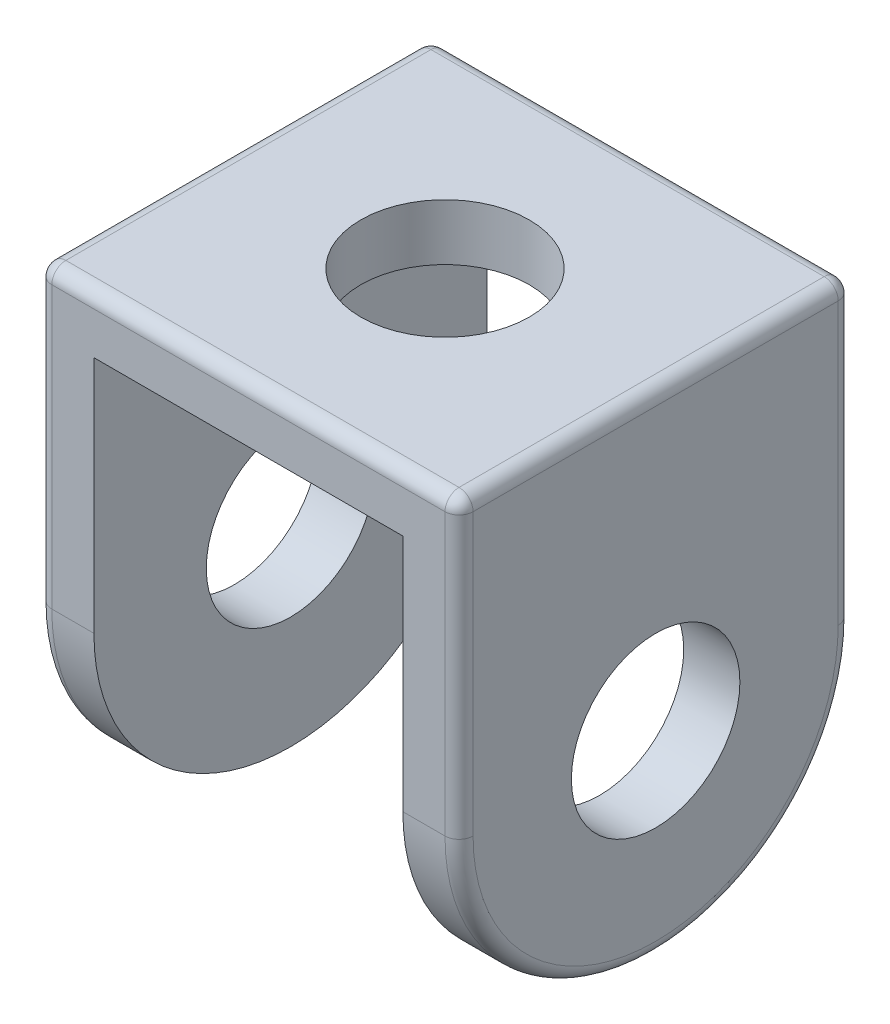
ISO-10303-21;
HEADER;
FILE_DESCRIPTION(('STEP AP214'),'2;1');
FILE_NAME('part.step','',(''),(''),'','','');
FILE_SCHEMA(('AUTOMOTIVE_DESIGN { 1 0 10303 214 1 1 1 1 }'));
ENDSEC;
DATA;
#1=APPLICATION_CONTEXT('core data for automotive mechanical design processes');
#2=APPLICATION_PROTOCOL_DEFINITION('international standard','automotive_design',2000,#1);
#3=PRODUCT_CONTEXT('',#1,'mechanical');
#4=PRODUCT('Part','Part','',(#3));
#5=PRODUCT_RELATED_PRODUCT_CATEGORY('part','',(#4));
#6=PRODUCT_DEFINITION_FORMATION('','',#4);
#7=PRODUCT_DEFINITION_CONTEXT('part definition',#1,'design');
#8=PRODUCT_DEFINITION('design','',#6,#7);
#9=PRODUCT_DEFINITION_SHAPE('','',#8);
#10=(LENGTH_UNIT() NAMED_UNIT(*) SI_UNIT(.MILLI.,.METRE.));
#11=(NAMED_UNIT(*) PLANE_ANGLE_UNIT() SI_UNIT($,.RADIAN.));
#12=(NAMED_UNIT(*) SI_UNIT($,.STERADIAN.) SOLID_ANGLE_UNIT());
#13=UNCERTAINTY_MEASURE_WITH_UNIT(LENGTH_MEASURE(1.E-05),#10,'distance_accuracy_value','');
#14=(GEOMETRIC_REPRESENTATION_CONTEXT(3) GLOBAL_UNCERTAINTY_ASSIGNED_CONTEXT((#13)) GLOBAL_UNIT_ASSIGNED_CONTEXT((#10,
#11,#12)) REPRESENTATION_CONTEXT('',''));
#15=CARTESIAN_POINT('',(0.,0.,0.));
#16=DIRECTION('',(0.,0.,1.));
#17=DIRECTION('',(1.,0.,0.));
#18=AXIS2_PLACEMENT_3D('',#15,#16,#17);
#19=CARTESIAN_POINT('',(30.,-21.,-14.));
#20=DIRECTION('',(-1.,0.,0.));
#21=DIRECTION('',(0.,0.,1.));
#22=AXIS2_PLACEMENT_3D('',#19,#20,#21);
#23=CYLINDRICAL_SURFACE('',#22,14.);
#24=DIRECTION('',(-1.,0.,0.));
#25=VECTOR('',#24,1.);
#26=CARTESIAN_POINT('',(30.,-21.,0.));
#27=LINE('',#26,#25);
#28=CARTESIAN_POINT('',(4.,-21.,0.));
#29=VERTEX_POINT('',#28);
#30=CARTESIAN_POINT('',(1.,-21.,0.));
#31=VERTEX_POINT('',#30);
#32=EDGE_CURVE('E188',#29,#31,#27,.T.);
#33=ORIENTED_EDGE('',*,*,#32,.T.);
#34=CARTESIAN_POINT('',(1.,-21.,-14.));
#35=DIRECTION('',(1.,0.,0.));
#36=DIRECTION('',(0.,0.,-1.));
#37=AXIS2_PLACEMENT_3D('',#34,#35,#36);
#38=CIRCLE('',#37,14.);
#39=CARTESIAN_POINT('',(1.,-21.,-28.));
#40=VERTEX_POINT('',#39);
#41=EDGE_CURVE('E214',#31,#40,#38,.T.);
#42=ORIENTED_EDGE('',*,*,#41,.T.);
#43=DIRECTION('',(-1.,0.,0.));
#44=VECTOR('',#43,1.);
#45=CARTESIAN_POINT('',(30.,-21.,-28.));
#46=LINE('',#45,#44);
#47=CARTESIAN_POINT('',(4.,-21.,-28.));
#48=VERTEX_POINT('',#47);
#49=EDGE_CURVE('E183',#48,#40,#46,.T.);
#50=ORIENTED_EDGE('',*,*,#49,.F.);
#51=CARTESIAN_POINT('',(4.00000000000001,-21.,-14.));
#52=DIRECTION('',(-1.,0.,0.));
#53=DIRECTION('',(0.,-1.,0.));
#54=AXIS2_PLACEMENT_3D('',#51,#52,#53);
#55=CIRCLE('',#54,14.);
#56=EDGE_CURVE('E155',#48,#29,#55,.T.);
#57=ORIENTED_EDGE('',*,*,#56,.T.);
#58=EDGE_LOOP('',(#33,#42,#50,#57));
#59=FACE_BOUND('',#58,.T.);
#60=ADVANCED_FACE('F37',(#59),#23,.T.);
#61=CARTESIAN_POINT('',(30.,-21.,-14.));
#62=DIRECTION('',(-1.,0.,0.));
#63=DIRECTION('',(0.,0.,1.));
#64=AXIS2_PLACEMENT_3D('',#61,#62,#63);
#65=CYLINDRICAL_SURFACE('',#64,6.);
#66=CARTESIAN_POINT('',(4.00000000000001,-21.,-14.));
#67=DIRECTION('',(-1.,0.,0.));
#68=DIRECTION('',(0.,-1.,0.));
#69=AXIS2_PLACEMENT_3D('',#66,#67,#68);
#70=CIRCLE('',#69,6.);
#71=CARTESIAN_POINT('',(4.00000000000001,-27.,-14.));
#72=VERTEX_POINT('',#71);
#73=EDGE_CURVE('E177',#72,#72,#70,.T.);
#74=ORIENTED_EDGE('',*,*,#73,.F.);
#75=EDGE_LOOP('',(#74));
#76=FACE_BOUND('',#75,.T.);
#77=CARTESIAN_POINT('',(0.,-21.,-14.));
#78=DIRECTION('',(1.,0.,0.));
#79=DIRECTION('',(0.,0.,-1.));
#80=AXIS2_PLACEMENT_3D('',#77,#78,#79);
#81=CIRCLE('',#80,6.);
#82=CARTESIAN_POINT('',(0.,-21.,-20.));
#83=VERTEX_POINT('',#82);
#84=EDGE_CURVE('E179',#83,#83,#81,.T.);
#85=ORIENTED_EDGE('',*,*,#84,.F.);
#86=EDGE_LOOP('',(#85));
#87=FACE_BOUND('',#86,.T.);
#88=ADVANCED_FACE('F310',(#76,#87),#65,.F.);
#89=CARTESIAN_POINT('',(30.,-21.,-14.));
#90=DIRECTION('',(1.,0.,0.));
#91=DIRECTION('',(0.,0.,-1.));
#92=AXIS2_PLACEMENT_3D('',#89,#90,#91);
#93=PLANE('',#92);
#94=CARTESIAN_POINT('',(30.,-21.,-14.));
#95=DIRECTION('',(1.,0.,0.));
#96=DIRECTION('',(0.,0.,-1.));
#97=AXIS2_PLACEMENT_3D('',#94,#95,#96);
#98=CIRCLE('',#97,13.);
#99=CARTESIAN_POINT('',(30.,-21.,-1.));
#100=VERTEX_POINT('',#99);
#101=CARTESIAN_POINT('',(30.,-21.,-27.));
#102=VERTEX_POINT('',#101);
#103=EDGE_CURVE('E220',#100,#102,#98,.T.);
#104=ORIENTED_EDGE('',*,*,#103,.T.);
#105=DIRECTION('',(0.,1.,0.));
#106=VECTOR('',#105,1.);
#107=CARTESIAN_POINT('',(30.,0.,-27.));
#108=LINE('',#107,#106);
#109=CARTESIAN_POINT('',(30.,-1.,-27.));
#110=VERTEX_POINT('',#109);
#111=EDGE_CURVE('E222',#102,#110,#108,.T.);
#112=ORIENTED_EDGE('',*,*,#111,.T.);
#113=DIRECTION('',(0.,0.,1.));
#114=VECTOR('',#113,1.);
#115=CARTESIAN_POINT('',(30.,-1.,0.));
#116=LINE('',#115,#114);
#117=CARTESIAN_POINT('',(30.,-1.,-1.));
#118=VERTEX_POINT('',#117);
#119=EDGE_CURVE('E216',#110,#118,#116,.T.);
#120=ORIENTED_EDGE('',*,*,#119,.T.);
#121=DIRECTION('',(0.,-1.,0.));
#122=VECTOR('',#121,1.);
#123=CARTESIAN_POINT('',(30.,-21.,-1.));
#124=LINE('',#123,#122);
#125=EDGE_CURVE('E218',#118,#100,#124,.T.);
#126=ORIENTED_EDGE('',*,*,#125,.T.);
#127=EDGE_LOOP('',(#104,#112,#120,#126));
#128=FACE_BOUND('',#127,.T.);
#129=CARTESIAN_POINT('',(30.,-21.,-14.));
#130=DIRECTION('',(1.,0.,0.));
#131=DIRECTION('',(0.,0.,-1.));
#132=AXIS2_PLACEMENT_3D('',#129,#130,#131);
#133=CIRCLE('',#132,6.);
#134=CARTESIAN_POINT('',(30.,-21.,-20.));
#135=VERTEX_POINT('',#134);
#136=EDGE_CURVE('E180',#135,#135,#133,.T.);
#137=ORIENTED_EDGE('',*,*,#136,.F.);
#138=EDGE_LOOP('',(#137));
#139=FACE_BOUND('',#138,.T.);
#140=ADVANCED_FACE('F305',(#128,#139),#93,.T.);
#141=CARTESIAN_POINT('',(0.,-21.,-14.));
#142=DIRECTION('',(1.,0.,0.));
#143=DIRECTION('',(0.,0.,-1.));
#144=AXIS2_PLACEMENT_3D('',#141,#142,#143);
#145=PLANE('',#144);
#146=DIRECTION('',(0.,0.,1.));
#147=VECTOR('',#146,1.);
#148=CARTESIAN_POINT('',(0.,-1.,-14.));
#149=LINE('',#148,#147);
#150=CARTESIAN_POINT('',(0.,-1.,-1.));
#151=VERTEX_POINT('',#150);
#152=CARTESIAN_POINT('',(0.,-1.,-27.));
#153=VERTEX_POINT('',#152);
#154=EDGE_CURVE('E205',#151,#153,#149,.F.);
#155=ORIENTED_EDGE('',*,*,#154,.T.);
#156=DIRECTION('',(0.,1.,0.));
#157=VECTOR('',#156,1.);
#158=CARTESIAN_POINT('',(0.,-21.,-27.));
#159=LINE('',#158,#157);
#160=CARTESIAN_POINT('',(0.,-21.,-27.));
#161=VERTEX_POINT('',#160);
#162=EDGE_CURVE('E211',#153,#161,#159,.F.);
#163=ORIENTED_EDGE('',*,*,#162,.T.);
#164=CARTESIAN_POINT('',(0.,-21.,-14.));
#165=DIRECTION('',(1.,0.,0.));
#166=DIRECTION('',(0.,0.,-1.));
#167=AXIS2_PLACEMENT_3D('',#164,#165,#166);
#168=CIRCLE('',#167,13.);
#169=CARTESIAN_POINT('',(0.,-21.,-1.));
#170=VERTEX_POINT('',#169);
#171=EDGE_CURVE('E209',#161,#170,#168,.F.);
#172=ORIENTED_EDGE('',*,*,#171,.T.);
#173=DIRECTION('',(0.,-1.,0.));
#174=VECTOR('',#173,1.);
#175=CARTESIAN_POINT('',(0.,-21.,-1.));
#176=LINE('',#175,#174);
#177=EDGE_CURVE('E207',#170,#151,#176,.F.);
#178=ORIENTED_EDGE('',*,*,#177,.T.);
#179=EDGE_LOOP('',(#155,#163,#172,#178));
#180=FACE_BOUND('',#179,.T.);
#181=ORIENTED_EDGE('',*,*,#84,.T.);
#182=EDGE_LOOP('',(#181));
#183=FACE_BOUND('',#182,.T.);
#184=ADVANCED_FACE('F296',(#180,#183),#145,.F.);
#185=CARTESIAN_POINT('',(30.,0.,-28.));
#186=DIRECTION('',(0.,-1.,0.));
#187=DIRECTION('',(0.,0.,-1.));
#188=AXIS2_PLACEMENT_3D('',#185,#186,#187);
#189=PLANE('',#188);
#190=DIRECTION('',(-1.,0.,0.));
#191=VECTOR('',#190,1.);
#192=CARTESIAN_POINT('',(30.,0.,-1.));
#193=LINE('',#192,#191);
#194=CARTESIAN_POINT('',(1.,0.,-1.));
#195=VERTEX_POINT('',#194);
#196=CARTESIAN_POINT('',(29.,0.,-1.));
#197=VERTEX_POINT('',#196);
#198=EDGE_CURVE('E233',#195,#197,#193,.F.);
#199=ORIENTED_EDGE('',*,*,#198,.T.);
#200=DIRECTION('',(0.,0.,1.));
#201=VECTOR('',#200,1.);
#202=CARTESIAN_POINT('',(29.,0.,-28.));
#203=LINE('',#202,#201);
#204=CARTESIAN_POINT('',(29.,0.,-27.));
#205=VERTEX_POINT('',#204);
#206=EDGE_CURVE('E11',#197,#205,#203,.F.);
#207=ORIENTED_EDGE('',*,*,#206,.T.);
#208=DIRECTION('',(-1.,0.,0.));
#209=VECTOR('',#208,1.);
#210=CARTESIAN_POINT('',(30.,0.,-27.));
#211=LINE('',#210,#209);
#212=CARTESIAN_POINT('',(1.,0.,-27.));
#213=VERTEX_POINT('',#212);
#214=EDGE_CURVE('E46',#205,#213,#211,.T.);
#215=ORIENTED_EDGE('',*,*,#214,.T.);
#216=DIRECTION('',(0.,0.,1.));
#217=VECTOR('',#216,1.);
#218=CARTESIAN_POINT('',(1.,0.,-28.));
#219=LINE('',#218,#217);
#220=EDGE_CURVE('E235',#213,#195,#219,.T.);
#221=ORIENTED_EDGE('',*,*,#220,.T.);
#222=EDGE_LOOP('',(#199,#207,#215,#221));
#223=FACE_BOUND('',#222,.T.);
#224=CARTESIAN_POINT('',(15.,0.,-14.));
#225=DIRECTION('',(0.,1.,0.));
#226=DIRECTION('',(0.,0.,1.));
#227=AXIS2_PLACEMENT_3D('',#224,#225,#226);
#228=CIRCLE('',#227,6.);
#229=CARTESIAN_POINT('',(15.,0.,-8.));
#230=VERTEX_POINT('',#229);
#231=EDGE_CURVE('E198',#230,#230,#228,.T.);
#232=ORIENTED_EDGE('',*,*,#231,.F.);
#233=EDGE_LOOP('',(#232));
#234=FACE_BOUND('',#233,.T.);
#235=ADVANCED_FACE('F293',(#223,#234),#189,.F.);
#236=CARTESIAN_POINT('',(30.,0.,0.));
#237=DIRECTION('',(0.,0.,-1.));
#238=DIRECTION('',(0.,1.,0.));
#239=AXIS2_PLACEMENT_3D('',#236,#237,#238);
#240=PLANE('',#239);
#241=DIRECTION('',(-1.,0.,0.));
#242=VECTOR('',#241,1.);
#243=CARTESIAN_POINT('',(30.,-1.,0.));
#244=LINE('',#243,#242);
#245=CARTESIAN_POINT('',(29.,-1.,0.));
#246=VERTEX_POINT('',#245);
#247=CARTESIAN_POINT('',(1.,-1.,0.));
#248=VERTEX_POINT('',#247);
#249=EDGE_CURVE('E227',#246,#248,#244,.T.);
#250=ORIENTED_EDGE('',*,*,#249,.T.);
#251=DIRECTION('',(0.,-1.,0.));
#252=VECTOR('',#251,1.);
#253=CARTESIAN_POINT('',(1.,0.,0.));
#254=LINE('',#253,#252);
#255=EDGE_CURVE('E231',#248,#31,#254,.T.);
#256=ORIENTED_EDGE('',*,*,#255,.T.);
#257=ORIENTED_EDGE('',*,*,#32,.F.);
#258=DIRECTION('',(0.,-1.,0.));
#259=VECTOR('',#258,1.);
#260=CARTESIAN_POINT('',(4.,-4.,0.));
#261=LINE('',#260,#259);
#262=CARTESIAN_POINT('',(4.,-4.,0.));
#263=VERTEX_POINT('',#262);
#264=EDGE_CURVE('E168',#263,#29,#261,.T.);
#265=ORIENTED_EDGE('',*,*,#264,.F.);
#266=DIRECTION('',(-1.,0.,0.));
#267=VECTOR('',#266,1.);
#268=CARTESIAN_POINT('',(4.,-4.,0.));
#269=LINE('',#268,#267);
#270=CARTESIAN_POINT('',(26.,-4.,0.));
#271=VERTEX_POINT('',#270);
#272=EDGE_CURVE('E145',#271,#263,#269,.T.);
#273=ORIENTED_EDGE('',*,*,#272,.F.);
#274=DIRECTION('',(0.,1.,0.));
#275=VECTOR('',#274,1.);
#276=CARTESIAN_POINT('',(26.,-4.,0.));
#277=LINE('',#276,#275);
#278=CARTESIAN_POINT('',(26.,-21.,0.));
#279=VERTEX_POINT('',#278);
#280=EDGE_CURVE('E170',#279,#271,#277,.T.);
#281=ORIENTED_EDGE('',*,*,#280,.F.);
#282=CARTESIAN_POINT('',(29.,-21.,0.));
#283=VERTEX_POINT('',#282);
#284=EDGE_CURVE('E189',#283,#279,#27,.T.);
#285=ORIENTED_EDGE('',*,*,#284,.F.);
#286=DIRECTION('',(0.,-1.,0.));
#287=VECTOR('',#286,1.);
#288=CARTESIAN_POINT('',(29.,0.,0.));
#289=LINE('',#288,#287);
#290=EDGE_CURVE('E229',#283,#246,#289,.F.);
#291=ORIENTED_EDGE('',*,*,#290,.T.);
#292=EDGE_LOOP('',(#250,#256,#257,#265,#273,#281,#285,#291));
#293=FACE_BOUND('',#292,.T.);
#294=ADVANCED_FACE('F295',(#293),#240,.F.);
#295=CARTESIAN_POINT('',(29.,-21.,-28.));
#296=VERTEX_POINT('',#295);
#297=CARTESIAN_POINT('',(26.,-21.,-28.));
#298=VERTEX_POINT('',#297);
#299=EDGE_CURVE('E186',#296,#298,#46,.T.);
#300=ORIENTED_EDGE('',*,*,#299,.F.);
#301=CARTESIAN_POINT('',(29.,-21.,-14.));
#302=DIRECTION('',(1.,0.,0.));
#303=DIRECTION('',(0.,0.,-1.));
#304=AXIS2_PLACEMENT_3D('',#301,#302,#303);
#305=CIRCLE('',#304,14.);
#306=EDGE_CURVE('E225',#296,#283,#305,.F.);
#307=ORIENTED_EDGE('',*,*,#306,.T.);
#308=ORIENTED_EDGE('',*,*,#284,.T.);
#309=CARTESIAN_POINT('',(26.,-21.,-14.));
#310=DIRECTION('',(1.,0.,0.));
#311=DIRECTION('',(0.,0.,-1.));
#312=AXIS2_PLACEMENT_3D('',#309,#310,#311);
#313=CIRCLE('',#312,14.);
#314=EDGE_CURVE('E174',#279,#298,#313,.T.);
#315=ORIENTED_EDGE('',*,*,#314,.T.);
#316=EDGE_LOOP('',(#300,#307,#308,#315));
#317=FACE_BOUND('',#316,.T.);
#318=ADVANCED_FACE('F302',(#317),#23,.T.);
#319=CARTESIAN_POINT('',(30.,-21.,-28.));
#320=DIRECTION('',(0.,0.,1.));
#321=DIRECTION('',(0.,-1.,0.));
#322=AXIS2_PLACEMENT_3D('',#319,#320,#321);
#323=PLANE('',#322);
#324=ORIENTED_EDGE('',*,*,#49,.T.);
#325=DIRECTION('',(0.,1.,0.));
#326=VECTOR('',#325,1.);
#327=CARTESIAN_POINT('',(1.,-21.,-28.));
#328=LINE('',#327,#326);
#329=CARTESIAN_POINT('',(1.,-1.,-28.));
#330=VERTEX_POINT('',#329);
#331=EDGE_CURVE('E202',#40,#330,#328,.T.);
#332=ORIENTED_EDGE('',*,*,#331,.T.);
#333=DIRECTION('',(-1.,0.,0.));
#334=VECTOR('',#333,1.);
#335=CARTESIAN_POINT('',(30.,-1.,-28.));
#336=LINE('',#335,#334);
#337=CARTESIAN_POINT('',(29.,-1.,-28.));
#338=VERTEX_POINT('',#337);
#339=EDGE_CURVE('E191',#330,#338,#336,.F.);
#340=ORIENTED_EDGE('',*,*,#339,.T.);
#341=DIRECTION('',(0.,1.,0.));
#342=VECTOR('',#341,1.);
#343=CARTESIAN_POINT('',(29.,-21.,-28.));
#344=LINE('',#343,#342);
#345=EDGE_CURVE('E200',#338,#296,#344,.F.);
#346=ORIENTED_EDGE('',*,*,#345,.T.);
#347=ORIENTED_EDGE('',*,*,#299,.T.);
#348=DIRECTION('',(0.,1.,0.));
#349=VECTOR('',#348,1.);
#350=CARTESIAN_POINT('',(26.,-4.,-28.));
#351=LINE('',#350,#349);
#352=CARTESIAN_POINT('',(26.,-4.,-28.));
#353=VERTEX_POINT('',#352);
#354=EDGE_CURVE('E159',#298,#353,#351,.T.);
#355=ORIENTED_EDGE('',*,*,#354,.T.);
#356=DIRECTION('',(-1.,0.,0.));
#357=VECTOR('',#356,1.);
#358=CARTESIAN_POINT('',(4.,-4.,-28.));
#359=LINE('',#358,#357);
#360=CARTESIAN_POINT('',(4.,-4.,-28.));
#361=VERTEX_POINT('',#360);
#362=EDGE_CURVE('E142',#353,#361,#359,.T.);
#363=ORIENTED_EDGE('',*,*,#362,.T.);
#364=DIRECTION('',(0.,-1.,0.));
#365=VECTOR('',#364,1.);
#366=CARTESIAN_POINT('',(4.,-4.,-28.));
#367=LINE('',#366,#365);
#368=EDGE_CURVE('E153',#361,#48,#367,.T.);
#369=ORIENTED_EDGE('',*,*,#368,.T.);
#370=EDGE_LOOP('',(#324,#332,#340,#346,#347,#355,#363,#369));
#371=FACE_BOUND('',#370,.T.);
#372=ADVANCED_FACE('F162',(#371),#323,.F.);
#373=CARTESIAN_POINT('',(26.,-21.,-14.));
#374=DIRECTION('',(1.,0.,0.));
#375=DIRECTION('',(0.,0.,-1.));
#376=AXIS2_PLACEMENT_3D('',#373,#374,#375);
#377=CIRCLE('',#376,6.);
#378=CARTESIAN_POINT('',(26.,-21.,-20.));
#379=VERTEX_POINT('',#378);
#380=EDGE_CURVE('E149',#379,#379,#377,.T.);
#381=ORIENTED_EDGE('',*,*,#380,.F.);
#382=EDGE_LOOP('',(#381));
#383=FACE_BOUND('',#382,.T.);
#384=ORIENTED_EDGE('',*,*,#136,.T.);
#385=EDGE_LOOP('',(#384));
#386=FACE_BOUND('',#385,.T.);
#387=ADVANCED_FACE('F318',(#383,#386),#65,.F.);
#388=CARTESIAN_POINT('',(4.,-4.,-28.));
#389=DIRECTION('',(-1.,0.,0.));
#390=DIRECTION('',(0.,-1.,0.));
#391=AXIS2_PLACEMENT_3D('',#388,#389,#390);
#392=PLANE('',#391);
#393=ORIENTED_EDGE('',*,*,#73,.T.);
#394=EDGE_LOOP('',(#393));
#395=FACE_BOUND('',#394,.T.);
#396=ORIENTED_EDGE('',*,*,#56,.F.);
#397=ORIENTED_EDGE('',*,*,#368,.F.);
#398=DIRECTION('',(0.,0.,1.));
#399=VECTOR('',#398,1.);
#400=CARTESIAN_POINT('',(4.,-4.,-28.));
#401=LINE('',#400,#399);
#402=EDGE_CURVE('E137',#361,#263,#401,.T.);
#403=ORIENTED_EDGE('',*,*,#402,.T.);
#404=ORIENTED_EDGE('',*,*,#264,.T.);
#405=EDGE_LOOP('',(#396,#397,#403,#404));
#406=FACE_BOUND('',#405,.T.);
#407=ADVANCED_FACE('F154',(#395,#406),#392,.F.);
#408=CARTESIAN_POINT('',(26.,-4.,-28.));
#409=DIRECTION('',(1.,0.,0.));
#410=DIRECTION('',(0.,0.,-1.));
#411=AXIS2_PLACEMENT_3D('',#408,#409,#410);
#412=PLANE('',#411);
#413=ORIENTED_EDGE('',*,*,#380,.T.);
#414=EDGE_LOOP('',(#413));
#415=FACE_BOUND('',#414,.T.);
#416=ORIENTED_EDGE('',*,*,#280,.T.);
#417=DIRECTION('',(0.,0.,1.));
#418=VECTOR('',#417,1.);
#419=CARTESIAN_POINT('',(26.,-4.,-28.));
#420=LINE('',#419,#418);
#421=EDGE_CURVE('E150',#353,#271,#420,.T.);
#422=ORIENTED_EDGE('',*,*,#421,.F.);
#423=ORIENTED_EDGE('',*,*,#354,.F.);
#424=ORIENTED_EDGE('',*,*,#314,.F.);
#425=EDGE_LOOP('',(#416,#422,#423,#424));
#426=FACE_BOUND('',#425,.T.);
#427=ADVANCED_FACE('F346',(#415,#426),#412,.F.);
#428=CARTESIAN_POINT('',(4.,-4.,-28.));
#429=DIRECTION('',(0.,1.,0.));
#430=DIRECTION('',(0.,0.,1.));
#431=AXIS2_PLACEMENT_3D('',#428,#429,#430);
#432=PLANE('',#431);
#433=CARTESIAN_POINT('',(15.,-4.,-14.));
#434=DIRECTION('',(0.,1.,0.));
#435=DIRECTION('',(0.,0.,1.));
#436=AXIS2_PLACEMENT_3D('',#433,#434,#435);
#437=CIRCLE('',#436,6.);
#438=CARTESIAN_POINT('',(15.,-4.,-8.));
#439=VERTEX_POINT('',#438);
#440=EDGE_CURVE('E171',#439,#439,#437,.T.);
#441=ORIENTED_EDGE('',*,*,#440,.T.);
#442=EDGE_LOOP('',(#441));
#443=FACE_BOUND('',#442,.T.);
#444=ORIENTED_EDGE('',*,*,#272,.T.);
#445=ORIENTED_EDGE('',*,*,#402,.F.);
#446=ORIENTED_EDGE('',*,*,#362,.F.);
#447=ORIENTED_EDGE('',*,*,#421,.T.);
#448=EDGE_LOOP('',(#444,#445,#446,#447));
#449=FACE_BOUND('',#448,.T.);
#450=ADVANCED_FACE('F139',(#443,#449),#432,.F.);
#451=CARTESIAN_POINT('',(15.,-30.,-14.));
#452=DIRECTION('',(0.,1.,0.));
#453=DIRECTION('',(0.,0.,1.));
#454=AXIS2_PLACEMENT_3D('',#451,#452,#453);
#455=CYLINDRICAL_SURFACE('',#454,6.);
#456=ORIENTED_EDGE('',*,*,#231,.T.);
#457=EDGE_LOOP('',(#456));
#458=FACE_BOUND('',#457,.T.);
#459=ORIENTED_EDGE('',*,*,#440,.F.);
#460=EDGE_LOOP('',(#459));
#461=FACE_BOUND('',#460,.T.);
#462=ADVANCED_FACE('F290',(#458,#461),#455,.F.);
#463=CARTESIAN_POINT('',(29.,-21.,-1.));
#464=DIRECTION('',(0.,1.,0.));
#465=DIRECTION('',(0.,0.,1.));
#466=AXIS2_PLACEMENT_3D('',#463,#464,#465);
#467=CYLINDRICAL_SURFACE('',#466,1.);
#468=CARTESIAN_POINT('',(29.,-1.,-1.));
#469=DIRECTION('',(0.,1.,0.));
#470=DIRECTION('',(0.,0.,1.));
#471=AXIS2_PLACEMENT_3D('',#468,#469,#470);
#472=CIRCLE('',#471,1.);
#473=EDGE_CURVE('E275',#246,#118,#472,.T.);
#474=ORIENTED_EDGE('',*,*,#473,.F.);
#475=ORIENTED_EDGE('',*,*,#290,.F.);
#476=CARTESIAN_POINT('',(29.,-21.,-1.));
#477=DIRECTION('',(0.,-1.,0.));
#478=DIRECTION('',(0.,0.,-1.));
#479=AXIS2_PLACEMENT_3D('',#476,#477,#478);
#480=CIRCLE('',#479,1.);
#481=EDGE_CURVE('E41',#100,#283,#480,.T.);
#482=ORIENTED_EDGE('',*,*,#481,.F.);
#483=ORIENTED_EDGE('',*,*,#125,.F.);
#484=EDGE_LOOP('',(#474,#475,#482,#483));
#485=FACE_BOUND('',#484,.T.);
#486=ADVANCED_FACE('F39',(#485),#467,.T.);
#487=CARTESIAN_POINT('',(29.,-21.,-14.));
#488=DIRECTION('',(1.,0.,0.));
#489=DIRECTION('',(0.,0.,-1.));
#490=AXIS2_PLACEMENT_3D('',#487,#488,#489);
#491=TOROIDAL_SURFACE('',#490,13.,1.);
#492=ORIENTED_EDGE('',*,*,#481,.T.);
#493=ORIENTED_EDGE('',*,*,#306,.F.);
#494=CARTESIAN_POINT('',(29.,-21.,-27.));
#495=DIRECTION('',(0.,1.,0.));
#496=DIRECTION('',(0.,0.,1.));
#497=AXIS2_PLACEMENT_3D('',#494,#495,#496);
#498=CIRCLE('',#497,1.);
#499=EDGE_CURVE('E273',#102,#296,#498,.T.);
#500=ORIENTED_EDGE('',*,*,#499,.F.);
#501=ORIENTED_EDGE('',*,*,#103,.F.);
#502=EDGE_LOOP('',(#492,#493,#500,#501));
#503=FACE_BOUND('',#502,.T.);
#504=ADVANCED_FACE('F330',(#503),#491,.T.);
#505=CARTESIAN_POINT('',(29.,-1.,-1.));
#506=DIRECTION('',(0.,0.,1.));
#507=DIRECTION('',(1.,0.,0.));
#508=AXIS2_PLACEMENT_3D('',#505,#506,#507);
#509=SPHERICAL_SURFACE('',#508,1.);
#510=CARTESIAN_POINT('',(29.,-1.,-1.));
#511=DIRECTION('',(1.,0.,0.));
#512=DIRECTION('',(0.,0.,-1.));
#513=AXIS2_PLACEMENT_3D('',#510,#511,#512);
#514=CIRCLE('',#513,1.);
#515=EDGE_CURVE('E267',#246,#197,#514,.F.);
#516=ORIENTED_EDGE('',*,*,#515,.F.);
#517=ORIENTED_EDGE('',*,*,#473,.T.);
#518=CARTESIAN_POINT('',(29.,-1.,-1.));
#519=DIRECTION('',(0.,0.,1.));
#520=DIRECTION('',(0.,-1.,0.));
#521=AXIS2_PLACEMENT_3D('',#518,#519,#520);
#522=CIRCLE('',#521,1.);
#523=EDGE_CURVE('E270',#197,#118,#522,.F.);
#524=ORIENTED_EDGE('',*,*,#523,.F.);
#525=EDGE_LOOP('',(#516,#517,#524));
#526=FACE_BOUND('',#525,.T.);
#527=ADVANCED_FACE('F374',(#526),#509,.T.);
#528=CARTESIAN_POINT('',(29.,-21.,-27.));
#529=DIRECTION('',(0.,-1.,0.));
#530=DIRECTION('',(0.,0.,-1.));
#531=AXIS2_PLACEMENT_3D('',#528,#529,#530);
#532=CYLINDRICAL_SURFACE('',#531,1.);
#533=ORIENTED_EDGE('',*,*,#499,.T.);
#534=ORIENTED_EDGE('',*,*,#345,.F.);
#535=CARTESIAN_POINT('',(29.,-1.,-27.));
#536=DIRECTION('',(0.,1.,0.));
#537=DIRECTION('',(0.,0.,1.));
#538=AXIS2_PLACEMENT_3D('',#535,#536,#537);
#539=CIRCLE('',#538,1.);
#540=EDGE_CURVE('E264',#110,#338,#539,.T.);
#541=ORIENTED_EDGE('',*,*,#540,.F.);
#542=ORIENTED_EDGE('',*,*,#111,.F.);
#543=EDGE_LOOP('',(#533,#534,#541,#542));
#544=FACE_BOUND('',#543,.T.);
#545=ADVANCED_FACE('F334',(#544),#532,.T.);
#546=CARTESIAN_POINT('',(29.,-1.,-14.));
#547=DIRECTION('',(0.,0.,-1.));
#548=DIRECTION('',(0.,1.,0.));
#549=AXIS2_PLACEMENT_3D('',#546,#547,#548);
#550=CYLINDRICAL_SURFACE('',#549,1.);
#551=ORIENTED_EDGE('',*,*,#523,.T.);
#552=ORIENTED_EDGE('',*,*,#119,.F.);
#553=CARTESIAN_POINT('',(29.,-1.,-27.));
#554=DIRECTION('',(0.,0.,-1.));
#555=DIRECTION('',(-1.,0.,0.));
#556=AXIS2_PLACEMENT_3D('',#553,#554,#555);
#557=CIRCLE('',#556,1.);
#558=EDGE_CURVE('E262',#205,#110,#557,.T.);
#559=ORIENTED_EDGE('',*,*,#558,.F.);
#560=ORIENTED_EDGE('',*,*,#206,.F.);
#561=EDGE_LOOP('',(#551,#552,#559,#560));
#562=FACE_BOUND('',#561,.T.);
#563=ADVANCED_FACE('F370',(#562),#550,.T.);
#564=CARTESIAN_POINT('',(30.,-1.,-1.));
#565=DIRECTION('',(-1.,0.,0.));
#566=DIRECTION('',(0.,0.,1.));
#567=AXIS2_PLACEMENT_3D('',#564,#565,#566);
#568=CYLINDRICAL_SURFACE('',#567,1.);
#569=ORIENTED_EDGE('',*,*,#515,.T.);
#570=ORIENTED_EDGE('',*,*,#198,.F.);
#571=CARTESIAN_POINT('',(1.,-1.,-1.));
#572=DIRECTION('',(-1.,0.,0.));
#573=DIRECTION('',(0.,0.,1.));
#574=AXIS2_PLACEMENT_3D('',#571,#572,#573);
#575=CIRCLE('',#574,1.);
#576=EDGE_CURVE('E259',#248,#195,#575,.T.);
#577=ORIENTED_EDGE('',*,*,#576,.F.);
#578=ORIENTED_EDGE('',*,*,#249,.F.);
#579=EDGE_LOOP('',(#569,#570,#577,#578));
#580=FACE_BOUND('',#579,.T.);
#581=ADVANCED_FACE('F373',(#580),#568,.T.);
#582=CARTESIAN_POINT('',(29.,-1.,-27.));
#583=DIRECTION('',(0.,0.,1.));
#584=DIRECTION('',(1.,0.,0.));
#585=AXIS2_PLACEMENT_3D('',#582,#583,#584);
#586=SPHERICAL_SURFACE('',#585,1.);
#587=ORIENTED_EDGE('',*,*,#558,.T.);
#588=ORIENTED_EDGE('',*,*,#540,.T.);
#589=CARTESIAN_POINT('',(29.,-1.,-27.));
#590=DIRECTION('',(1.,0.,0.));
#591=DIRECTION('',(0.,0.,-1.));
#592=AXIS2_PLACEMENT_3D('',#589,#590,#591);
#593=CIRCLE('',#592,1.);
#594=EDGE_CURVE('E254',#205,#338,#593,.F.);
#595=ORIENTED_EDGE('',*,*,#594,.F.);
#596=EDGE_LOOP('',(#587,#588,#595));
#597=FACE_BOUND('',#596,.T.);
#598=ADVANCED_FACE('F367',(#597),#586,.T.);
#599=CARTESIAN_POINT('',(1.,-1.,-1.));
#600=DIRECTION('',(0.,0.,1.));
#601=DIRECTION('',(1.,0.,0.));
#602=AXIS2_PLACEMENT_3D('',#599,#600,#601);
#603=SPHERICAL_SURFACE('',#602,1.);
#604=CARTESIAN_POINT('',(1.,-1.,-1.));
#605=DIRECTION('',(0.,0.,1.));
#606=DIRECTION('',(1.,0.,0.));
#607=AXIS2_PLACEMENT_3D('',#604,#605,#606);
#608=CIRCLE('',#607,1.);
#609=EDGE_CURVE('E251',#151,#195,#608,.F.);
#610=ORIENTED_EDGE('',*,*,#609,.F.);
#611=CARTESIAN_POINT('',(1.,-1.,-1.));
#612=DIRECTION('',(0.,1.,0.));
#613=DIRECTION('',(0.,0.,1.));
#614=AXIS2_PLACEMENT_3D('',#611,#612,#613);
#615=CIRCLE('',#614,1.);
#616=EDGE_CURVE('E256',#248,#151,#615,.F.);
#617=ORIENTED_EDGE('',*,*,#616,.F.);
#618=ORIENTED_EDGE('',*,*,#576,.T.);
#619=EDGE_LOOP('',(#610,#617,#618));
#620=FACE_BOUND('',#619,.T.);
#621=ADVANCED_FACE('F389',(#620),#603,.T.);
#622=CARTESIAN_POINT('',(1.,0.,-1.));
#623=DIRECTION('',(0.,-1.,0.));
#624=DIRECTION('',(0.,0.,-1.));
#625=AXIS2_PLACEMENT_3D('',#622,#623,#624);
#626=CYLINDRICAL_SURFACE('',#625,1.);
#627=ORIENTED_EDGE('',*,*,#616,.T.);
#628=ORIENTED_EDGE('',*,*,#177,.F.);
#629=CARTESIAN_POINT('',(1.,-21.,-1.));
#630=DIRECTION('',(0.,-1.,0.));
#631=DIRECTION('',(0.,0.,-1.));
#632=AXIS2_PLACEMENT_3D('',#629,#630,#631);
#633=CIRCLE('',#632,1.);
#634=EDGE_CURVE('E248',#31,#170,#633,.T.);
#635=ORIENTED_EDGE('',*,*,#634,.F.);
#636=ORIENTED_EDGE('',*,*,#255,.F.);
#637=EDGE_LOOP('',(#627,#628,#635,#636));
#638=FACE_BOUND('',#637,.T.);
#639=ADVANCED_FACE('F353',(#638),#626,.T.);
#640=CARTESIAN_POINT('',(30.,-1.,-27.));
#641=DIRECTION('',(-1.,0.,0.));
#642=DIRECTION('',(0.,0.,1.));
#643=AXIS2_PLACEMENT_3D('',#640,#641,#642);
#644=CYLINDRICAL_SURFACE('',#643,1.);
#645=ORIENTED_EDGE('',*,*,#594,.T.);
#646=ORIENTED_EDGE('',*,*,#339,.F.);
#647=CARTESIAN_POINT('',(1.,-1.,-27.));
#648=DIRECTION('',(-1.,0.,0.));
#649=DIRECTION('',(0.,0.,1.));
#650=AXIS2_PLACEMENT_3D('',#647,#648,#649);
#651=CIRCLE('',#650,1.);
#652=EDGE_CURVE('E245',#213,#330,#651,.T.);
#653=ORIENTED_EDGE('',*,*,#652,.F.);
#654=ORIENTED_EDGE('',*,*,#214,.F.);
#655=EDGE_LOOP('',(#645,#646,#653,#654));
#656=FACE_BOUND('',#655,.T.);
#657=ADVANCED_FACE('F364',(#656),#644,.T.);
#658=CARTESIAN_POINT('',(1.,-1.,-28.));
#659=DIRECTION('',(0.,0.,1.));
#660=DIRECTION('',(0.,-1.,0.));
#661=AXIS2_PLACEMENT_3D('',#658,#659,#660);
#662=CYLINDRICAL_SURFACE('',#661,1.);
#663=ORIENTED_EDGE('',*,*,#609,.T.);
#664=ORIENTED_EDGE('',*,*,#220,.F.);
#665=CARTESIAN_POINT('',(1.,-1.,-27.));
#666=DIRECTION('',(0.,0.,-1.));
#667=DIRECTION('',(-1.,0.,0.));
#668=AXIS2_PLACEMENT_3D('',#665,#666,#667);
#669=CIRCLE('',#668,1.);
#670=EDGE_CURVE('E242',#153,#213,#669,.T.);
#671=ORIENTED_EDGE('',*,*,#670,.F.);
#672=ORIENTED_EDGE('',*,*,#154,.F.);
#673=EDGE_LOOP('',(#663,#664,#671,#672));
#674=FACE_BOUND('',#673,.T.);
#675=ADVANCED_FACE('F397',(#674),#662,.T.);
#676=CARTESIAN_POINT('',(1.,-21.,-14.));
#677=DIRECTION('',(1.,0.,0.));
#678=DIRECTION('',(0.,0.,-1.));
#679=AXIS2_PLACEMENT_3D('',#676,#677,#678);
#680=TOROIDAL_SURFACE('',#679,13.,1.);
#681=ORIENTED_EDGE('',*,*,#634,.T.);
#682=ORIENTED_EDGE('',*,*,#171,.F.);
#683=CARTESIAN_POINT('',(1.,-21.,-27.));
#684=DIRECTION('',(0.,1.,0.));
#685=DIRECTION('',(0.,0.,1.));
#686=AXIS2_PLACEMENT_3D('',#683,#684,#685);
#687=CIRCLE('',#686,1.);
#688=EDGE_CURVE('E240',#40,#161,#687,.T.);
#689=ORIENTED_EDGE('',*,*,#688,.F.);
#690=ORIENTED_EDGE('',*,*,#41,.F.);
#691=EDGE_LOOP('',(#681,#682,#689,#690));
#692=FACE_BOUND('',#691,.T.);
#693=ADVANCED_FACE('F357',(#692),#680,.T.);
#694=CARTESIAN_POINT('',(1.,-1.,-27.));
#695=DIRECTION('',(0.,0.,1.));
#696=DIRECTION('',(1.,0.,0.));
#697=AXIS2_PLACEMENT_3D('',#694,#695,#696);
#698=SPHERICAL_SURFACE('',#697,1.);
#699=ORIENTED_EDGE('',*,*,#670,.T.);
#700=ORIENTED_EDGE('',*,*,#652,.T.);
#701=CARTESIAN_POINT('',(1.,-1.,-27.));
#702=DIRECTION('',(0.,1.,0.));
#703=DIRECTION('',(0.,0.,1.));
#704=AXIS2_PLACEMENT_3D('',#701,#702,#703);
#705=CIRCLE('',#704,1.);
#706=EDGE_CURVE('E238',#153,#330,#705,.F.);
#707=ORIENTED_EDGE('',*,*,#706,.F.);
#708=EDGE_LOOP('',(#699,#700,#707));
#709=FACE_BOUND('',#708,.T.);
#710=ADVANCED_FACE('F403',(#709),#698,.T.);
#711=CARTESIAN_POINT('',(1.,-21.,-27.));
#712=DIRECTION('',(0.,1.,0.));
#713=DIRECTION('',(0.,0.,1.));
#714=AXIS2_PLACEMENT_3D('',#711,#712,#713);
#715=CYLINDRICAL_SURFACE('',#714,1.);
#716=ORIENTED_EDGE('',*,*,#688,.T.);
#717=ORIENTED_EDGE('',*,*,#162,.F.);
#718=ORIENTED_EDGE('',*,*,#706,.T.);
#719=ORIENTED_EDGE('',*,*,#331,.F.);
#720=EDGE_LOOP('',(#716,#717,#718,#719));
#721=FACE_BOUND('',#720,.T.);
#722=ADVANCED_FACE('F361',(#721),#715,.T.);
#723=CLOSED_SHELL('',(#60,#88,#140,#184,#235,#294,#318,#372,#387,#407,#427,#450,#462,#486,#504,
#527,#545,#563,#581,#598,#621,#639,#657,#675,#693,#710,#722));
#724=MANIFOLD_SOLID_BREP('B2',#723);
#725=ADVANCED_BREP_SHAPE_REPRESENTATION('',(#18,#724),#14);
#726=SHAPE_DEFINITION_REPRESENTATION(#9,#725);
ENDSEC;
END-ISO-10303-21;
